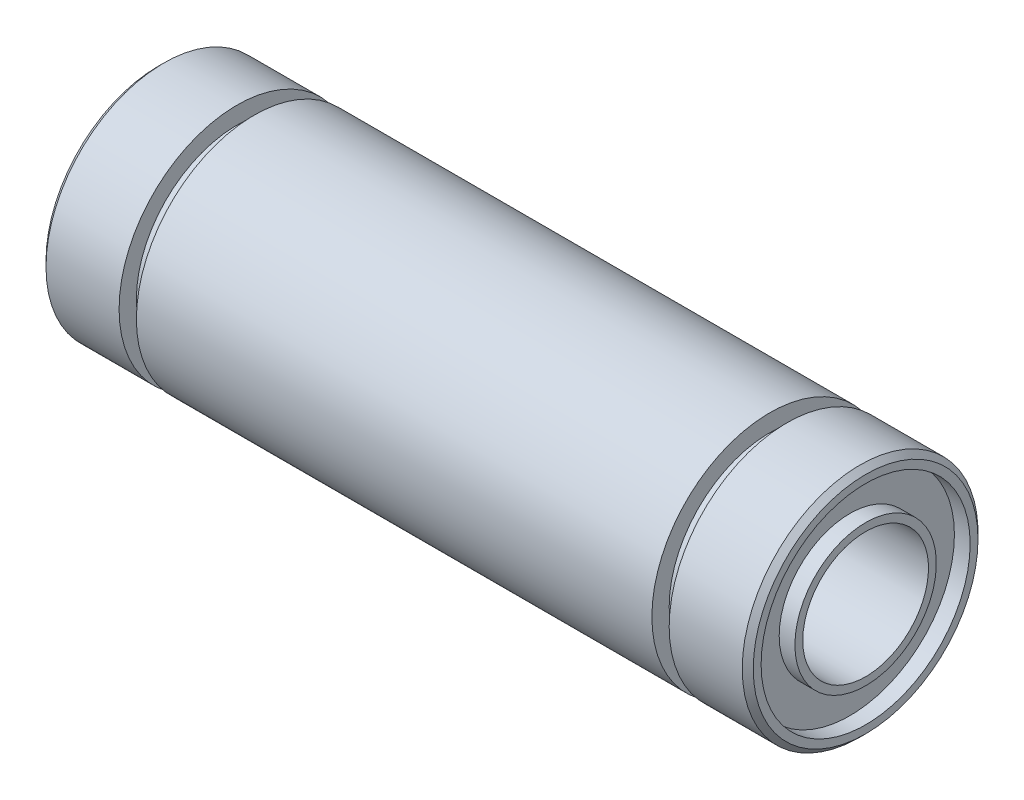
ISO-10303-21;
HEADER;
FILE_DESCRIPTION(('STEP AP214'),'2;1');
FILE_NAME('part.step','',(''),(''),'','','');
FILE_SCHEMA(('AUTOMOTIVE_DESIGN { 1 0 10303 214 1 1 1 1 }'));
ENDSEC;
DATA;
#1=APPLICATION_CONTEXT('core data for automotive mechanical design processes');
#2=APPLICATION_PROTOCOL_DEFINITION('international standard','automotive_design',2000,#1);
#3=PRODUCT_CONTEXT('',#1,'mechanical');
#4=PRODUCT('Part','Part','',(#3));
#5=PRODUCT_RELATED_PRODUCT_CATEGORY('part','',(#4));
#6=PRODUCT_DEFINITION_FORMATION('','',#4);
#7=PRODUCT_DEFINITION_CONTEXT('part definition',#1,'design');
#8=PRODUCT_DEFINITION('design','',#6,#7);
#9=PRODUCT_DEFINITION_SHAPE('','',#8);
#10=(LENGTH_UNIT() NAMED_UNIT(*) SI_UNIT(.MILLI.,.METRE.));
#11=(NAMED_UNIT(*) PLANE_ANGLE_UNIT() SI_UNIT($,.RADIAN.));
#12=(NAMED_UNIT(*) SI_UNIT($,.STERADIAN.) SOLID_ANGLE_UNIT());
#13=UNCERTAINTY_MEASURE_WITH_UNIT(LENGTH_MEASURE(1.E-05),#10,'distance_accuracy_value','');
#14=(GEOMETRIC_REPRESENTATION_CONTEXT(3) GLOBAL_UNCERTAINTY_ASSIGNED_CONTEXT((#13)) GLOBAL_UNIT_ASSIGNED_CONTEXT((#10,
#11,#12)) REPRESENTATION_CONTEXT('',''));
#15=CARTESIAN_POINT('',(0.,0.,0.));
#16=DIRECTION('',(0.,0.,1.));
#17=DIRECTION('',(1.,0.,0.));
#18=AXIS2_PLACEMENT_3D('',#15,#16,#17);
#19=CARTESIAN_POINT('',(22.15,0.,0.));
#20=DIRECTION('',(-1.,0.,0.));
#21=DIRECTION('',(0.,0.,1.));
#22=AXIS2_PLACEMENT_3D('',#19,#20,#21);
#23=CONICAL_SURFACE('',#22,7.5,0.785398163397476);
#24=CARTESIAN_POINT('',(22.5,0.,0.));
#25=DIRECTION('',(-1.,0.,0.));
#26=DIRECTION('',(0.,0.,1.));
#27=AXIS2_PLACEMENT_3D('',#24,#25,#26);
#28=CIRCLE('',#27,7.15);
#29=CARTESIAN_POINT('',(22.5,0.,7.15));
#30=VERTEX_POINT('',#29);
#31=EDGE_CURVE('E105',#30,#30,#28,.T.);
#32=ORIENTED_EDGE('',*,*,#31,.T.);
#33=EDGE_LOOP('',(#32));
#34=FACE_BOUND('',#33,.T.);
#35=CARTESIAN_POINT('',(22.15,0.,0.));
#36=DIRECTION('',(-1.,0.,0.));
#37=DIRECTION('',(0.,0.,1.));
#38=AXIS2_PLACEMENT_3D('',#35,#36,#37);
#39=CIRCLE('',#38,7.5);
#40=CARTESIAN_POINT('',(22.15,0.,7.5));
#41=VERTEX_POINT('',#40);
#42=EDGE_CURVE('E10',#41,#41,#39,.T.);
#43=ORIENTED_EDGE('',*,*,#42,.F.);
#44=EDGE_LOOP('',(#43));
#45=FACE_BOUND('',#44,.T.);
#46=ADVANCED_FACE('F35',(#34,#45),#23,.T.);
#47=CARTESIAN_POINT('',(-45.6895053247726,0.,0.));
#48=DIRECTION('',(-1.,0.,0.));
#49=DIRECTION('',(0.,0.,1.));
#50=AXIS2_PLACEMENT_3D('',#47,#48,#49);
#51=CYLINDRICAL_SURFACE('',#50,7.5);
#52=CARTESIAN_POINT('',(17.5,0.,0.));
#53=DIRECTION('',(-1.,0.,0.));
#54=DIRECTION('',(0.,0.,1.));
#55=AXIS2_PLACEMENT_3D('',#52,#53,#54);
#56=CIRCLE('',#55,7.5);
#57=CARTESIAN_POINT('',(17.5,0.,7.5));
#58=VERTEX_POINT('',#57);
#59=EDGE_CURVE('E41',#58,#58,#56,.T.);
#60=ORIENTED_EDGE('',*,*,#59,.F.);
#61=EDGE_LOOP('',(#60));
#62=FACE_BOUND('',#61,.T.);
#63=ORIENTED_EDGE('',*,*,#42,.T.);
#64=EDGE_LOOP('',(#63));
#65=FACE_BOUND('',#64,.T.);
#66=ADVANCED_FACE('F123',(#62,#65),#51,.T.);
#67=CARTESIAN_POINT('',(17.5,0.,0.));
#68=DIRECTION('',(1.,0.,0.));
#69=DIRECTION('',(0.,0.,-1.));
#70=AXIS2_PLACEMENT_3D('',#67,#68,#69);
#71=PLANE('',#70);
#72=CARTESIAN_POINT('',(17.5,0.,0.));
#73=DIRECTION('',(-1.,0.,0.));
#74=DIRECTION('',(0.,0.,1.));
#75=AXIS2_PLACEMENT_3D('',#72,#73,#74);
#76=CIRCLE('',#75,6.4);
#77=CARTESIAN_POINT('',(17.5,0.,6.4));
#78=VERTEX_POINT('',#77);
#79=EDGE_CURVE('E45',#78,#78,#76,.T.);
#80=ORIENTED_EDGE('',*,*,#79,.F.);
#81=EDGE_LOOP('',(#80));
#82=FACE_BOUND('',#81,.T.);
#83=ORIENTED_EDGE('',*,*,#59,.T.);
#84=EDGE_LOOP('',(#83));
#85=FACE_BOUND('',#84,.T.);
#86=ADVANCED_FACE('F127',(#82,#85),#71,.F.);
#87=CARTESIAN_POINT('',(-45.6895053247726,0.,0.));
#88=DIRECTION('',(-1.,0.,0.));
#89=DIRECTION('',(0.,0.,1.));
#90=AXIS2_PLACEMENT_3D('',#87,#88,#89);
#91=CYLINDRICAL_SURFACE('',#90,6.4);
#92=CARTESIAN_POINT('',(16.4,0.,0.));
#93=DIRECTION('',(-1.,0.,0.));
#94=DIRECTION('',(0.,0.,1.));
#95=AXIS2_PLACEMENT_3D('',#92,#93,#94);
#96=CIRCLE('',#95,6.4);
#97=CARTESIAN_POINT('',(16.4,0.,6.4));
#98=VERTEX_POINT('',#97);
#99=EDGE_CURVE('E49',#98,#98,#96,.T.);
#100=ORIENTED_EDGE('',*,*,#99,.F.);
#101=EDGE_LOOP('',(#100));
#102=FACE_BOUND('',#101,.T.);
#103=ORIENTED_EDGE('',*,*,#79,.T.);
#104=EDGE_LOOP('',(#103));
#105=FACE_BOUND('',#104,.T.);
#106=ADVANCED_FACE('F132',(#102,#105),#91,.T.);
#107=CARTESIAN_POINT('',(16.4,0.,0.));
#108=DIRECTION('',(-1.,0.,0.));
#109=DIRECTION('',(0.,0.,1.));
#110=AXIS2_PLACEMENT_3D('',#107,#108,#109);
#111=PLANE('',#110);
#112=CARTESIAN_POINT('',(16.4,0.,0.));
#113=DIRECTION('',(-1.,0.,0.));
#114=DIRECTION('',(0.,0.,1.));
#115=AXIS2_PLACEMENT_3D('',#112,#113,#114);
#116=CIRCLE('',#115,7.5);
#117=CARTESIAN_POINT('',(16.4,0.,7.5));
#118=VERTEX_POINT('',#117);
#119=EDGE_CURVE('E54',#118,#118,#116,.T.);
#120=ORIENTED_EDGE('',*,*,#119,.F.);
#121=EDGE_LOOP('',(#120));
#122=FACE_BOUND('',#121,.T.);
#123=ORIENTED_EDGE('',*,*,#99,.T.);
#124=EDGE_LOOP('',(#123));
#125=FACE_BOUND('',#124,.T.);
#126=ADVANCED_FACE('F138',(#122,#125),#111,.F.);
#127=CARTESIAN_POINT('',(-45.6895053247726,0.,0.));
#128=DIRECTION('',(-1.,0.,0.));
#129=DIRECTION('',(0.,0.,1.));
#130=AXIS2_PLACEMENT_3D('',#127,#128,#129);
#131=CYLINDRICAL_SURFACE('',#130,7.5);
#132=ORIENTED_EDGE('',*,*,#119,.T.);
#133=EDGE_LOOP('',(#132));
#134=FACE_BOUND('',#133,.T.);
#135=CARTESIAN_POINT('',(-16.4,0.,0.));
#136=DIRECTION('',(-1.,0.,0.));
#137=DIRECTION('',(0.,0.,1.));
#138=AXIS2_PLACEMENT_3D('',#135,#136,#137);
#139=CIRCLE('',#138,7.5);
#140=CARTESIAN_POINT('',(-16.4,0.,7.5));
#141=VERTEX_POINT('',#140);
#142=EDGE_CURVE('E57',#141,#141,#139,.T.);
#143=ORIENTED_EDGE('',*,*,#142,.F.);
#144=EDGE_LOOP('',(#143));
#145=FACE_BOUND('',#144,.T.);
#146=ADVANCED_FACE('F142',(#134,#145),#131,.T.);
#147=CARTESIAN_POINT('',(-16.4,0.,0.));
#148=DIRECTION('',(-1.,0.,0.));
#149=DIRECTION('',(0.,0.,1.));
#150=AXIS2_PLACEMENT_3D('',#147,#148,#149);
#151=PLANE('',#150);
#152=ORIENTED_EDGE('',*,*,#142,.T.);
#153=EDGE_LOOP('',(#152));
#154=FACE_BOUND('',#153,.T.);
#155=CARTESIAN_POINT('',(-16.4,0.,0.));
#156=DIRECTION('',(-1.,0.,0.));
#157=DIRECTION('',(0.,0.,1.));
#158=AXIS2_PLACEMENT_3D('',#155,#156,#157);
#159=CIRCLE('',#158,6.4);
#160=CARTESIAN_POINT('',(-16.4,0.,6.4));
#161=VERTEX_POINT('',#160);
#162=EDGE_CURVE('E60',#161,#161,#159,.T.);
#163=ORIENTED_EDGE('',*,*,#162,.F.);
#164=EDGE_LOOP('',(#163));
#165=FACE_BOUND('',#164,.T.);
#166=ADVANCED_FACE('F146',(#154,#165),#151,.T.);
#167=CARTESIAN_POINT('',(-45.6895053247726,0.,0.));
#168=DIRECTION('',(-1.,0.,0.));
#169=DIRECTION('',(0.,0.,1.));
#170=AXIS2_PLACEMENT_3D('',#167,#168,#169);
#171=CYLINDRICAL_SURFACE('',#170,6.4);
#172=ORIENTED_EDGE('',*,*,#162,.T.);
#173=EDGE_LOOP('',(#172));
#174=FACE_BOUND('',#173,.T.);
#175=CARTESIAN_POINT('',(-17.5,0.,0.));
#176=DIRECTION('',(-1.,0.,0.));
#177=DIRECTION('',(0.,0.,1.));
#178=AXIS2_PLACEMENT_3D('',#175,#176,#177);
#179=CIRCLE('',#178,6.4);
#180=CARTESIAN_POINT('',(-17.5,0.,6.4));
#181=VERTEX_POINT('',#180);
#182=EDGE_CURVE('E63',#181,#181,#179,.T.);
#183=ORIENTED_EDGE('',*,*,#182,.F.);
#184=EDGE_LOOP('',(#183));
#185=FACE_BOUND('',#184,.T.);
#186=ADVANCED_FACE('F150',(#174,#185),#171,.T.);
#187=CARTESIAN_POINT('',(-17.5,0.,0.));
#188=DIRECTION('',(1.,0.,0.));
#189=DIRECTION('',(0.,0.,-1.));
#190=AXIS2_PLACEMENT_3D('',#187,#188,#189);
#191=PLANE('',#190);
#192=ORIENTED_EDGE('',*,*,#182,.T.);
#193=EDGE_LOOP('',(#192));
#194=FACE_BOUND('',#193,.T.);
#195=CARTESIAN_POINT('',(-17.5,0.,0.));
#196=DIRECTION('',(-1.,0.,0.));
#197=DIRECTION('',(0.,0.,1.));
#198=AXIS2_PLACEMENT_3D('',#195,#196,#197);
#199=CIRCLE('',#198,7.5);
#200=CARTESIAN_POINT('',(-17.5,0.,7.5));
#201=VERTEX_POINT('',#200);
#202=EDGE_CURVE('E66',#201,#201,#199,.T.);
#203=ORIENTED_EDGE('',*,*,#202,.F.);
#204=EDGE_LOOP('',(#203));
#205=FACE_BOUND('',#204,.T.);
#206=ADVANCED_FACE('F154',(#194,#205),#191,.T.);
#207=CARTESIAN_POINT('',(-45.6895053247726,0.,0.));
#208=DIRECTION('',(-1.,0.,0.));
#209=DIRECTION('',(0.,0.,1.));
#210=AXIS2_PLACEMENT_3D('',#207,#208,#209);
#211=CYLINDRICAL_SURFACE('',#210,7.5);
#212=ORIENTED_EDGE('',*,*,#202,.T.);
#213=EDGE_LOOP('',(#212));
#214=FACE_BOUND('',#213,.T.);
#215=CARTESIAN_POINT('',(-22.15,0.,0.));
#216=DIRECTION('',(-1.,0.,0.));
#217=DIRECTION('',(0.,0.,1.));
#218=AXIS2_PLACEMENT_3D('',#215,#216,#217);
#219=CIRCLE('',#218,7.49999999999999);
#220=CARTESIAN_POINT('',(-22.15,0.,7.49999999999999));
#221=VERTEX_POINT('',#220);
#222=EDGE_CURVE('E69',#221,#221,#219,.T.);
#223=ORIENTED_EDGE('',*,*,#222,.F.);
#224=EDGE_LOOP('',(#223));
#225=FACE_BOUND('',#224,.T.);
#226=ADVANCED_FACE('F158',(#214,#225),#211,.T.);
#227=CARTESIAN_POINT('',(-22.15,0.,0.));
#228=DIRECTION('',(1.,0.,0.));
#229=DIRECTION('',(0.,0.,-1.));
#230=AXIS2_PLACEMENT_3D('',#227,#228,#229);
#231=CONICAL_SURFACE('',#230,7.49999999999999,0.785398163397461);
#232=CARTESIAN_POINT('',(-22.5,0.,0.));
#233=DIRECTION('',(-1.,0.,0.));
#234=DIRECTION('',(0.,0.,1.));
#235=AXIS2_PLACEMENT_3D('',#232,#233,#234);
#236=CIRCLE('',#235,7.15);
#237=CARTESIAN_POINT('',(-22.5,0.,7.15));
#238=VERTEX_POINT('',#237);
#239=EDGE_CURVE('E72',#238,#238,#236,.T.);
#240=ORIENTED_EDGE('',*,*,#239,.F.);
#241=EDGE_LOOP('',(#240));
#242=FACE_BOUND('',#241,.T.);
#243=ORIENTED_EDGE('',*,*,#222,.T.);
#244=EDGE_LOOP('',(#243));
#245=FACE_BOUND('',#244,.T.);
#246=ADVANCED_FACE('F162',(#242,#245),#231,.T.);
#247=CARTESIAN_POINT('',(-22.5,0.,0.));
#248=DIRECTION('',(1.,0.,0.));
#249=DIRECTION('',(0.,0.,-1.));
#250=AXIS2_PLACEMENT_3D('',#247,#248,#249);
#251=PLANE('',#250);
#252=CARTESIAN_POINT('',(-22.5,0.,0.));
#253=DIRECTION('',(-1.,0.,0.));
#254=DIRECTION('',(0.,0.,1.));
#255=AXIS2_PLACEMENT_3D('',#252,#253,#254);
#256=CIRCLE('',#255,6.65);
#257=CARTESIAN_POINT('',(-22.5,0.,6.65));
#258=VERTEX_POINT('',#257);
#259=EDGE_CURVE('E75',#258,#258,#256,.T.);
#260=ORIENTED_EDGE('',*,*,#259,.F.);
#261=EDGE_LOOP('',(#260));
#262=FACE_BOUND('',#261,.T.);
#263=ORIENTED_EDGE('',*,*,#239,.T.);
#264=EDGE_LOOP('',(#263));
#265=FACE_BOUND('',#264,.T.);
#266=ADVANCED_FACE('F166',(#262,#265),#251,.F.);
#267=CARTESIAN_POINT('',(-45.6895053247726,0.,0.));
#268=DIRECTION('',(-1.,0.,0.));
#269=DIRECTION('',(0.,0.,1.));
#270=AXIS2_PLACEMENT_3D('',#267,#268,#269);
#271=CYLINDRICAL_SURFACE('',#270,6.65);
#272=CARTESIAN_POINT('',(-21.5,0.,0.));
#273=DIRECTION('',(-1.,0.,0.));
#274=DIRECTION('',(0.,0.,1.));
#275=AXIS2_PLACEMENT_3D('',#272,#273,#274);
#276=CIRCLE('',#275,6.65);
#277=CARTESIAN_POINT('',(-21.5,0.,6.65));
#278=VERTEX_POINT('',#277);
#279=EDGE_CURVE('E78',#278,#278,#276,.T.);
#280=ORIENTED_EDGE('',*,*,#279,.F.);
#281=EDGE_LOOP('',(#280));
#282=FACE_BOUND('',#281,.T.);
#283=ORIENTED_EDGE('',*,*,#259,.T.);
#284=EDGE_LOOP('',(#283));
#285=FACE_BOUND('',#284,.T.);
#286=ADVANCED_FACE('F170',(#282,#285),#271,.F.);
#287=CARTESIAN_POINT('',(-21.5,0.,0.));
#288=DIRECTION('',(1.,0.,0.));
#289=DIRECTION('',(0.,0.,-1.));
#290=AXIS2_PLACEMENT_3D('',#287,#288,#289);
#291=PLANE('',#290);
#292=CARTESIAN_POINT('',(-21.5,0.,0.));
#293=DIRECTION('',(-1.,0.,0.));
#294=DIRECTION('',(0.,0.,1.));
#295=AXIS2_PLACEMENT_3D('',#292,#293,#294);
#296=CIRCLE('',#295,4.5);
#297=CARTESIAN_POINT('',(-21.5,0.,4.5));
#298=VERTEX_POINT('',#297);
#299=EDGE_CURVE('E81',#298,#298,#296,.T.);
#300=ORIENTED_EDGE('',*,*,#299,.F.);
#301=EDGE_LOOP('',(#300));
#302=FACE_BOUND('',#301,.T.);
#303=ORIENTED_EDGE('',*,*,#279,.T.);
#304=EDGE_LOOP('',(#303));
#305=FACE_BOUND('',#304,.T.);
#306=ADVANCED_FACE('F174',(#302,#305),#291,.F.);
#307=CARTESIAN_POINT('',(-45.6895053247726,0.,0.));
#308=DIRECTION('',(-1.,0.,0.));
#309=DIRECTION('',(0.,0.,1.));
#310=AXIS2_PLACEMENT_3D('',#307,#308,#309);
#311=CYLINDRICAL_SURFACE('',#310,4.5);
#312=CARTESIAN_POINT('',(-22.5,0.,0.));
#313=DIRECTION('',(-1.,0.,0.));
#314=DIRECTION('',(0.,0.,1.));
#315=AXIS2_PLACEMENT_3D('',#312,#313,#314);
#316=CIRCLE('',#315,4.5);
#317=CARTESIAN_POINT('',(-22.5,0.,4.5));
#318=VERTEX_POINT('',#317);
#319=EDGE_CURVE('E84',#318,#318,#316,.T.);
#320=ORIENTED_EDGE('',*,*,#319,.F.);
#321=EDGE_LOOP('',(#320));
#322=FACE_BOUND('',#321,.T.);
#323=ORIENTED_EDGE('',*,*,#299,.T.);
#324=EDGE_LOOP('',(#323));
#325=FACE_BOUND('',#324,.T.);
#326=ADVANCED_FACE('F178',(#322,#325),#311,.T.);
#327=CARTESIAN_POINT('',(-22.5,0.,0.));
#328=DIRECTION('',(1.,0.,0.));
#329=DIRECTION('',(0.,0.,-1.));
#330=AXIS2_PLACEMENT_3D('',#327,#328,#329);
#331=PLANE('',#330);
#332=CARTESIAN_POINT('',(-22.5,0.,0.));
#333=DIRECTION('',(-1.,0.,0.));
#334=DIRECTION('',(0.,0.,1.));
#335=AXIS2_PLACEMENT_3D('',#332,#333,#334);
#336=CIRCLE('',#335,4.);
#337=CARTESIAN_POINT('',(-22.5,0.,4.));
#338=VERTEX_POINT('',#337);
#339=EDGE_CURVE('E87',#338,#338,#336,.T.);
#340=ORIENTED_EDGE('',*,*,#339,.F.);
#341=EDGE_LOOP('',(#340));
#342=FACE_BOUND('',#341,.T.);
#343=ORIENTED_EDGE('',*,*,#319,.T.);
#344=EDGE_LOOP('',(#343));
#345=FACE_BOUND('',#344,.T.);
#346=ADVANCED_FACE('F182',(#342,#345),#331,.F.);
#347=CARTESIAN_POINT('',(-45.6895053247726,0.,0.));
#348=DIRECTION('',(-1.,0.,0.));
#349=DIRECTION('',(0.,0.,1.));
#350=AXIS2_PLACEMENT_3D('',#347,#348,#349);
#351=CYLINDRICAL_SURFACE('',#350,4.);
#352=CARTESIAN_POINT('',(22.5,0.,0.));
#353=DIRECTION('',(-1.,0.,0.));
#354=DIRECTION('',(0.,0.,1.));
#355=AXIS2_PLACEMENT_3D('',#352,#353,#354);
#356=CIRCLE('',#355,4.00000000000001);
#357=CARTESIAN_POINT('',(22.5,0.,4.00000000000001));
#358=VERTEX_POINT('',#357);
#359=EDGE_CURVE('E90',#358,#358,#356,.T.);
#360=ORIENTED_EDGE('',*,*,#359,.F.);
#361=EDGE_LOOP('',(#360));
#362=FACE_BOUND('',#361,.T.);
#363=ORIENTED_EDGE('',*,*,#339,.T.);
#364=EDGE_LOOP('',(#363));
#365=FACE_BOUND('',#364,.T.);
#366=ADVANCED_FACE('F186',(#362,#365),#351,.F.);
#367=CARTESIAN_POINT('',(22.5,0.,0.));
#368=DIRECTION('',(1.,0.,0.));
#369=DIRECTION('',(0.,0.,-1.));
#370=AXIS2_PLACEMENT_3D('',#367,#368,#369);
#371=PLANE('',#370);
#372=ORIENTED_EDGE('',*,*,#359,.T.);
#373=EDGE_LOOP('',(#372));
#374=FACE_BOUND('',#373,.T.);
#375=CARTESIAN_POINT('',(22.5,0.,0.));
#376=DIRECTION('',(-1.,0.,0.));
#377=DIRECTION('',(0.,0.,1.));
#378=AXIS2_PLACEMENT_3D('',#375,#376,#377);
#379=CIRCLE('',#378,4.50000000000001);
#380=CARTESIAN_POINT('',(22.5,0.,4.50000000000001));
#381=VERTEX_POINT('',#380);
#382=EDGE_CURVE('E93',#381,#381,#379,.T.);
#383=ORIENTED_EDGE('',*,*,#382,.F.);
#384=EDGE_LOOP('',(#383));
#385=FACE_BOUND('',#384,.T.);
#386=ADVANCED_FACE('F190',(#374,#385),#371,.T.);
#387=CARTESIAN_POINT('',(-45.6895053247726,0.,0.));
#388=DIRECTION('',(-1.,0.,0.));
#389=DIRECTION('',(0.,0.,1.));
#390=AXIS2_PLACEMENT_3D('',#387,#388,#389);
#391=CYLINDRICAL_SURFACE('',#390,4.50000000000001);
#392=ORIENTED_EDGE('',*,*,#382,.T.);
#393=EDGE_LOOP('',(#392));
#394=FACE_BOUND('',#393,.T.);
#395=CARTESIAN_POINT('',(21.5,0.,0.));
#396=DIRECTION('',(-1.,0.,0.));
#397=DIRECTION('',(0.,0.,1.));
#398=AXIS2_PLACEMENT_3D('',#395,#396,#397);
#399=CIRCLE('',#398,4.50000000000001);
#400=CARTESIAN_POINT('',(21.5,0.,4.50000000000001));
#401=VERTEX_POINT('',#400);
#402=EDGE_CURVE('E96',#401,#401,#399,.T.);
#403=ORIENTED_EDGE('',*,*,#402,.F.);
#404=EDGE_LOOP('',(#403));
#405=FACE_BOUND('',#404,.T.);
#406=ADVANCED_FACE('F194',(#394,#405),#391,.T.);
#407=CARTESIAN_POINT('',(21.5,0.,0.));
#408=DIRECTION('',(1.,0.,0.));
#409=DIRECTION('',(0.,0.,-1.));
#410=AXIS2_PLACEMENT_3D('',#407,#408,#409);
#411=PLANE('',#410);
#412=ORIENTED_EDGE('',*,*,#402,.T.);
#413=EDGE_LOOP('',(#412));
#414=FACE_BOUND('',#413,.T.);
#415=CARTESIAN_POINT('',(21.5,0.,0.));
#416=DIRECTION('',(-1.,0.,0.));
#417=DIRECTION('',(0.,0.,1.));
#418=AXIS2_PLACEMENT_3D('',#415,#416,#417);
#419=CIRCLE('',#418,6.65);
#420=CARTESIAN_POINT('',(21.5,0.,6.65));
#421=VERTEX_POINT('',#420);
#422=EDGE_CURVE('E99',#421,#421,#419,.T.);
#423=ORIENTED_EDGE('',*,*,#422,.F.);
#424=EDGE_LOOP('',(#423));
#425=FACE_BOUND('',#424,.T.);
#426=ADVANCED_FACE('F119',(#414,#425),#411,.T.);
#427=CARTESIAN_POINT('',(-45.6895053247726,0.,0.));
#428=DIRECTION('',(-1.,0.,0.));
#429=DIRECTION('',(0.,0.,1.));
#430=AXIS2_PLACEMENT_3D('',#427,#428,#429);
#431=CYLINDRICAL_SURFACE('',#430,6.65);
#432=ORIENTED_EDGE('',*,*,#422,.T.);
#433=EDGE_LOOP('',(#432));
#434=FACE_BOUND('',#433,.T.);
#435=CARTESIAN_POINT('',(22.5,0.,0.));
#436=DIRECTION('',(-1.,0.,0.));
#437=DIRECTION('',(0.,0.,1.));
#438=AXIS2_PLACEMENT_3D('',#435,#436,#437);
#439=CIRCLE('',#438,6.65);
#440=CARTESIAN_POINT('',(22.5,0.,6.65));
#441=VERTEX_POINT('',#440);
#442=EDGE_CURVE('E102',#441,#441,#439,.T.);
#443=ORIENTED_EDGE('',*,*,#442,.F.);
#444=EDGE_LOOP('',(#443));
#445=FACE_BOUND('',#444,.T.);
#446=ADVANCED_FACE('F113',(#434,#445),#431,.F.);
#447=CARTESIAN_POINT('',(22.5,0.,0.));
#448=DIRECTION('',(1.,0.,0.));
#449=DIRECTION('',(0.,0.,-1.));
#450=AXIS2_PLACEMENT_3D('',#447,#448,#449);
#451=PLANE('',#450);
#452=ORIENTED_EDGE('',*,*,#442,.T.);
#453=EDGE_LOOP('',(#452));
#454=FACE_BOUND('',#453,.T.);
#455=ORIENTED_EDGE('',*,*,#31,.F.);
#456=EDGE_LOOP('',(#455));
#457=FACE_BOUND('',#456,.T.);
#458=ADVANCED_FACE('F111',(#454,#457),#451,.T.);
#459=CLOSED_SHELL('',(#46,#66,#86,#106,#126,#146,#166,#186,#206,#226,#246,#266,#286,#306,#326,
#346,#366,#386,#406,#426,#446,#458));
#460=MANIFOLD_SOLID_BREP('B2',#459);
#461=ADVANCED_BREP_SHAPE_REPRESENTATION('',(#18,#460),#14);
#462=SHAPE_DEFINITION_REPRESENTATION(#9,#461);
ENDSEC;
END-ISO-10303-21;
